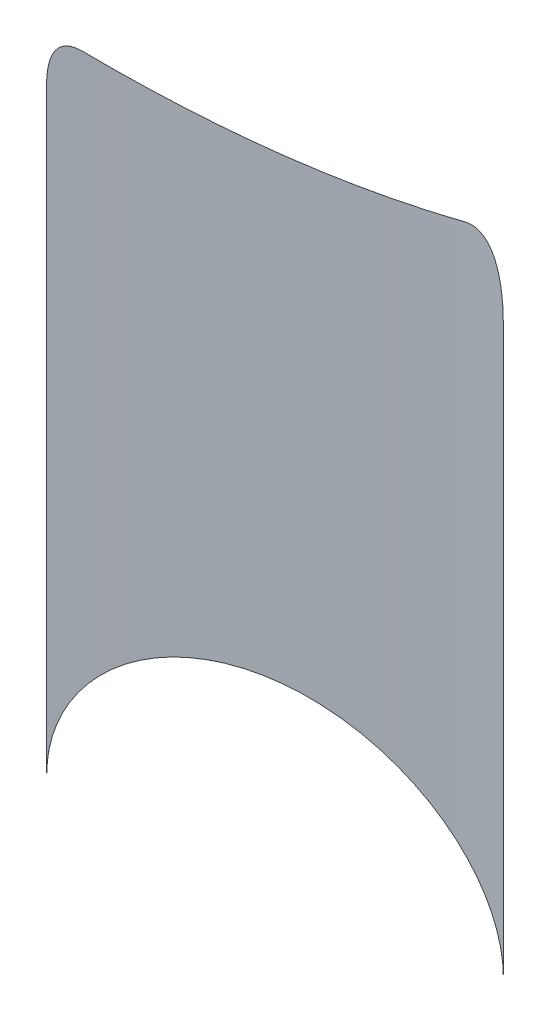
ISO-10303-21;
HEADER;
FILE_DESCRIPTION(('STEP AP214'),'2;1');
FILE_NAME('part.step','',(''),(''),'','','');
FILE_SCHEMA(('AUTOMOTIVE_DESIGN { 1 0 10303 214 1 1 1 1 }'));
ENDSEC;
DATA;
#1=APPLICATION_CONTEXT('core data for automotive mechanical design processes');
#2=APPLICATION_PROTOCOL_DEFINITION('international standard','automotive_design',2000,#1);
#3=PRODUCT_CONTEXT('',#1,'mechanical');
#4=PRODUCT('Part','Part','',(#3));
#5=PRODUCT_RELATED_PRODUCT_CATEGORY('part','',(#4));
#6=PRODUCT_DEFINITION_FORMATION('','',#4);
#7=PRODUCT_DEFINITION_CONTEXT('part definition',#1,'design');
#8=PRODUCT_DEFINITION('design','',#6,#7);
#9=PRODUCT_DEFINITION_SHAPE('','',#8);
#10=(LENGTH_UNIT() NAMED_UNIT(*) SI_UNIT(.MILLI.,.METRE.));
#11=(NAMED_UNIT(*) PLANE_ANGLE_UNIT() SI_UNIT($,.RADIAN.));
#12=(NAMED_UNIT(*) SI_UNIT($,.STERADIAN.) SOLID_ANGLE_UNIT());
#13=UNCERTAINTY_MEASURE_WITH_UNIT(LENGTH_MEASURE(1.E-05),#10,'distance_accuracy_value','');
#14=(GEOMETRIC_REPRESENTATION_CONTEXT(3) GLOBAL_UNCERTAINTY_ASSIGNED_CONTEXT((#13)) GLOBAL_UNIT_ASSIGNED_CONTEXT((#10,
#11,#12)) REPRESENTATION_CONTEXT('',''));
#15=CARTESIAN_POINT('',(0.,0.,0.));
#16=DIRECTION('',(0.,0.,1.));
#17=DIRECTION('',(1.,0.,0.));
#18=AXIS2_PLACEMENT_3D('',#15,#16,#17);
#19=CARTESIAN_POINT('',(8.98025612106915,25.4,8.98025612106916));
#20=DIRECTION('',(-0.707106781186548,0.,0.707106781186547));
#21=DIRECTION('',(0.707106781186547,0.,0.707106781186548));
#22=AXIS2_PLACEMENT_3D('',#19,#20,#21);
#23=PLANE('',#22);
#24=DIRECTION('',(0.,-1.,0.));
#25=VECTOR('',#24,1.);
#26=CARTESIAN_POINT('',(0.,25.4,0.));
#27=LINE('',#26,#25);
#28=CARTESIAN_POINT('',(0.,1.06417616721808,0.));
#29=VERTEX_POINT('',#28);
#30=CARTESIAN_POINT('',(0.,0.,0.));
#31=VERTEX_POINT('',#30);
#32=EDGE_CURVE('E98',#29,#31,#27,.T.);
#33=ORIENTED_EDGE('',*,*,#32,.F.);
#34=DIRECTION('',(-0.295766009193433,-0.908319842132484,-0.295766009193433));
#35=VECTOR('',#34,1.);
#36=CARTESIAN_POINT('',(8.10896364051453,25.967418408936,8.10896364051454));
#37=LINE('',#36,#35);
#38=CARTESIAN_POINT('',(6.89226441781786,22.2308428338847,6.89226441781787));
#39=VERTEX_POINT('',#38);
#40=EDGE_CURVE('E50',#29,#39,#37,.F.);
#41=ORIENTED_EDGE('',*,*,#40,.T.);
#42=DIRECTION('',(0.,1.,0.));
#43=VECTOR('',#42,1.);
#44=CARTESIAN_POINT('',(6.89226441781786,0.,6.89226441781787));
#45=LINE('',#44,#43);
#46=CARTESIAN_POINT('',(6.89226441781787,0.,6.89226441781787));
#47=VERTEX_POINT('',#46);
#48=EDGE_CURVE('E81',#39,#47,#45,.F.);
#49=ORIENTED_EDGE('',*,*,#48,.T.);
#50=DIRECTION('',(-0.707106781186547,0.,-0.707106781186548));
#51=VECTOR('',#50,1.);
#52=CARTESIAN_POINT('',(8.98025612106915,0.,8.98025612106916));
#53=LINE('',#52,#51);
#54=EDGE_CURVE('E84',#47,#31,#53,.T.);
#55=ORIENTED_EDGE('',*,*,#54,.T.);
#56=EDGE_LOOP('',(#33,#41,#49,#55));
#57=FACE_BOUND('',#56,.T.);
#58=ADVANCED_FACE('F33',(#57),#23,.F.);
#59=CARTESIAN_POINT('',(0.,25.4,0.));
#60=DIRECTION('',(0.707106781186548,0.,0.707106781186547));
#61=DIRECTION('',(0.707106781186547,0.,-0.707106781186548));
#62=AXIS2_PLACEMENT_3D('',#59,#60,#61);
#63=PLANE('',#62);
#64=DIRECTION('',(-0.3638034375545,0.857492925712544,0.3638034375545));
#65=VECTOR('',#64,1.);
#66=CARTESIAN_POINT('',(-7.19169637985441,19.2976432658842,7.19169637985442));
#67=LINE('',#66,#65);
#68=CARTESIAN_POINT('',(-8.98025612106915,23.5133190044515,8.98025612106916));
#69=VERTEX_POINT('',#68);
#70=CARTESIAN_POINT('',(-0.0480911682092548,2.46000430830475,0.0480911682092557));
#71=VERTEX_POINT('',#70);
#72=EDGE_CURVE('E58',#69,#71,#67,.F.);
#73=ORIENTED_EDGE('',*,*,#72,.T.);
#74=CARTESIAN_POINT('',(-1.79605122421383,1.06417616721809,1.79605122421383));
#75=DIRECTION('',(0.707106781186548,0.,0.707106781186547));
#76=DIRECTION('',(0.,-1.,0.));
#77=AXIS2_PLACEMENT_3D('',#74,#75,#76);
#78=ELLIPSE('',#77,6.07254102360086,2.54);
#79=EDGE_CURVE('E190',#71,#29,#78,.F.);
#80=ORIENTED_EDGE('',*,*,#79,.T.);
#81=ORIENTED_EDGE('',*,*,#32,.T.);
#82=CARTESIAN_POINT('',(-4.49012806053458,0.,4.49012806053458));
#83=DIRECTION('',(-0.707106781186548,0.,-0.707106781186547));
#84=DIRECTION('',(-0.707106781186547,0.,0.707106781186548));
#85=AXIS2_PLACEMENT_3D('',#82,#83,#84);
#86=CIRCLE('',#85,6.35);
#87=CARTESIAN_POINT('',(-8.98025612106915,0.,8.98025612106915));
#88=VERTEX_POINT('',#87);
#89=EDGE_CURVE('E88',#88,#31,#86,.T.);
#90=ORIENTED_EDGE('',*,*,#89,.F.);
#91=DIRECTION('',(0.,-1.,0.));
#92=VECTOR('',#91,1.);
#93=CARTESIAN_POINT('',(-8.98025612106915,25.4,8.98025612106915));
#94=LINE('',#93,#92);
#95=EDGE_CURVE('E94',#69,#88,#94,.T.);
#96=ORIENTED_EDGE('',*,*,#95,.F.);
#97=EDGE_LOOP('',(#73,#80,#81,#90,#96));
#98=FACE_BOUND('',#97,.T.);
#99=ADVANCED_FACE('F135',(#98),#63,.F.);
#100=CARTESIAN_POINT('',(4.49112806053458,0.,13.4713841816037));
#101=DIRECTION('',(-0.707106781186548,0.,-0.707106781186547));
#102=DIRECTION('',(-0.707106781186547,0.,0.707106781186548));
#103=AXIS2_PLACEMENT_3D('',#100,#101,#102);
#104=CYLINDRICAL_SURFACE('',#103,6.35);
#105=ORIENTED_EDGE('',*,*,#54,.F.);
#106=CARTESIAN_POINT('',(6.89226441781787,0.,6.89226441781787));
#107=CARTESIAN_POINT('',(6.89231786268577,0.146464266932523,6.89226603189647));
#108=CARTESIAN_POINT('',(6.88534393608151,0.292903551711731,6.89250786652074));
#109=CARTESIAN_POINT('',(6.85774536016748,0.58437728353009,6.89348342121486));
#110=CARTESIAN_POINT('',(6.83713137518341,0.729412738326902,6.89421675701585));
#111=CARTESIAN_POINT('',(6.78288330166258,1.01575440562524,6.89617848832311));
#112=CARTESIAN_POINT('',(6.74935952272647,1.15708166015502,6.89740269308693));
#113=CARTESIAN_POINT('',(6.66997671763164,1.43622946655273,6.90036756184506));
#114=CARTESIAN_POINT('',(6.6241159018581,1.57404950648552,6.90210830077175));
#115=CARTESIAN_POINT('',(6.52106426830367,1.84486526237348,6.90612637994501));
#116=CARTESIAN_POINT('',(6.46390980368465,1.97787487840589,6.90840200279425));
#117=CARTESIAN_POINT('',(6.33910394979764,2.23888758463778,6.91352345788086));
#118=CARTESIAN_POINT('',(6.271448650845,2.36688878778235,6.9163695026139));
#119=CARTESIAN_POINT('',(6.05394436014109,2.74297661096257,6.92582153160135));
#120=CARTESIAN_POINT('',(5.88969582449479,2.982792457952,6.93333635730444));
#121=CARTESIAN_POINT('',(5.45962023332488,3.52740374877561,6.95454882343234));
#122=CARTESIAN_POINT('',(5.17925017573937,3.82065502091561,6.96951574534301));
#123=CARTESIAN_POINT('',(4.7266375383656,4.22347198930852,6.99634391436973));
#124=CARTESIAN_POINT('',(4.57020668481364,4.35170554005229,7.00603122212342));
#125=CARTESIAN_POINT('',(4.24817707801223,4.59595325611578,7.02693193610189));
#126=CARTESIAN_POINT('',(4.08257814973793,4.71196718803176,7.03814537146745));
#127=CARTESIAN_POINT('',(3.47628180805622,5.10535651982054,7.08112248210658));
#128=CARTESIAN_POINT('',(3.01329173828311,5.34892477247129,7.11742455559746));
#129=CARTESIAN_POINT('',(2.29555315845657,5.65506900755827,7.18018408217893));
#130=CARTESIAN_POINT('',(2.05226528829994,5.74728980655902,7.20250558254947));
#131=CARTESIAN_POINT('',(1.55935259452895,5.9122643909091,7.24996220167878));
#132=CARTESIAN_POINT('',(1.30972823015546,5.98501958265347,7.27509711698139));
#133=CARTESIAN_POINT('',(0.802954853204813,6.11174135014063,7.32847649473377));
#134=CARTESIAN_POINT('',(0.545751941078245,6.16547774598268,7.35675394659011));
#135=CARTESIAN_POINT('',(0.0282539286177793,6.25285396692723,7.41610562000074));
#136=CARTESIAN_POINT('',(-0.232042355694297,6.2864858267193,7.44718094445436));
#137=CARTESIAN_POINT('',(-1.01543535765003,6.35676895362889,7.54449634510395));
#138=CARTESIAN_POINT('',(-1.54129235236765,6.36287162878345,7.61485265650282));
#139=CARTESIAN_POINT('',(-2.34394964255661,6.30686231553066,7.72996941383935));
#140=CARTESIAN_POINT('',(-2.62370678885989,6.2749275565033,7.77156026853689));
#141=CARTESIAN_POINT('',(-3.17898156920784,6.18569715037695,7.85694997365709));
#142=CARTESIAN_POINT('',(-3.45449852780518,6.1283975051352,7.9007491712052));
#143=CARTESIAN_POINT('',(-3.99818001377298,5.98781502390654,7.9899079483081));
#144=CARTESIAN_POINT('',(-4.26635361569772,5.90456599209868,8.03526542988176));
#145=CARTESIAN_POINT('',(-4.79274413138009,5.71141859279293,8.12685180912806));
#146=CARTESIAN_POINT('',(-5.05096537516956,5.6015319698893,8.17308031450196));
#147=CARTESIAN_POINT('',(-5.48013868435251,5.39096474578477,8.25189856022911));
#148=CARTESIAN_POINT('',(-5.65443959357658,5.29706601921951,8.28450466454691));
#149=CARTESIAN_POINT('',(-5.99508639732982,5.09570547271911,8.34930103909034));
#150=CARTESIAN_POINT('',(-6.16143421646501,4.98824695732417,8.38149140853128));
#151=CARTESIAN_POINT('',(-6.48474987782162,4.75981950106652,8.44502161648687));
#152=CARTESIAN_POINT('',(-6.64171858179995,4.63885180437206,8.4763615329966));
#153=CARTESIAN_POINT('',(-6.94468036242119,4.38367162799479,8.53769408471028));
#154=CARTESIAN_POINT('',(-7.09067852163273,4.24946534913265,8.56768734118668));
#155=CARTESIAN_POINT('',(-7.37141312714916,3.96690683144641,8.62607778306396));
#156=CARTESIAN_POINT('',(-7.50603543538131,3.81843734286062,8.65445802719843));
#157=CARTESIAN_POINT('',(-7.76078540057205,3.50908791766845,8.7087509958779));
#158=CARTESIAN_POINT('',(-7.88091276010341,3.34820772651328,8.7346636697876));
#159=CARTESIAN_POINT('',(-8.104763244882,3.01528636703068,8.78339893810602));
#160=CARTESIAN_POINT('',(-8.2085095828281,2.843261488096,8.80622589839449));
#161=CARTESIAN_POINT('',(-8.39811244981295,2.48921583493486,8.84825850935189));
#162=CARTESIAN_POINT('',(-8.48397316805694,2.30719741406438,8.86746500791211));
#163=CARTESIAN_POINT('',(-8.62839890123783,1.95418073615665,8.89995854176545));
#164=CARTESIAN_POINT('',(-8.68887202997785,1.78399950930717,8.91365306195356));
#165=CARTESIAN_POINT('',(-8.7933261196175,1.43842654687922,8.93739658454374));
#166=CARTESIAN_POINT('',(-8.83731011327611,1.26303577587524,8.94744625731214));
#167=CARTESIAN_POINT('',(-8.90833571020233,0.907365222328347,8.96371134360323));
#168=CARTESIAN_POINT('',(-8.93525709532225,0.727059885004358,8.96989954572311));
#169=CARTESIAN_POINT('',(-8.96222988884391,0.455206687917933,8.97610467707343));
#170=CARTESIAN_POINT('',(-8.96898595779961,0.364312516855359,8.97766019891954));
#171=CARTESIAN_POINT('',(-8.97799968204063,0.182284254532988,8.97973621841577));
#172=CARTESIAN_POINT('',(-8.98025706954431,0.0911501493145293,8.98025665445295));
#173=CARTESIAN_POINT('',(-8.98025612106915,0.,8.98025612106916));
#174=B_SPLINE_CURVE_WITH_KNOTS('',3,(#106,#107,#108,#109,#110,#111,#112,#113,#114,#115,#116,
#117,#118,#119,#120,#121,#122,#123,#124,#125,#126,#127,#128,#129,#130,#131,#132,#133,#134,#135,
#136,#137,#138,#139,#140,#141,#142,#143,#144,#145,#146,#147,#148,#149,#150,#151,#152,#153,#154,
#155,#156,#157,#158,#159,#160,#161,#162,#163,#164,#165,#166,#167,#168,#169,#170,#171,#172,#173),
.UNSPECIFIED.,.F.,.F.,(4,2,2,2,2,2,2,2,2,2,2,2,2,2,2,2,2,2,2,2,2,2,2,2,2,2,2,2,2,2,2,2,2,4),(0.,
0.439187234392796,0.87803150028592,1.3132063440877,1.74844434857404,2.18230353980809,
2.61632465529158,3.48549768418151,4.69654991425257,5.30360526434246,5.91067220753581,
7.47435838769038,8.25722222233591,9.04002947958805,9.83201061851013,10.6243053285468,
12.208106776988,13.0610870196728,13.9142017613559,14.7662097654097,15.6178427976393,
16.2192450957366,16.8205011132564,17.4217018019099,18.0226222192899,18.6289922855524,
19.2353747920322,19.8408901604922,20.4462635440797,20.9888042223851,21.5312450650542,
22.0774665011611,22.3508394379037,22.6242286465399),.UNSPECIFIED.);
#175=EDGE_CURVE('E92',#47,#88,#174,.T.);
#176=ORIENTED_EDGE('',*,*,#175,.T.);
#177=ORIENTED_EDGE('',*,*,#89,.T.);
#178=EDGE_LOOP('',(#105,#176,#177));
#179=FACE_BOUND('',#178,.T.);
#180=ADVANCED_FACE('F100',(#179),#104,.F.);
#181=CARTESIAN_POINT('',(9.83817531139002,0.,90.6604804010124));
#182=DIRECTION('',(0.,1.,0.));
#183=DIRECTION('',(0.,0.,1.));
#184=AXIS2_PLACEMENT_3D('',#181,#182,#183);
#185=CYLINDRICAL_SURFACE('',#184,83.82);
#186=ORIENTED_EDGE('',*,*,#48,.F.);
#187=CARTESIAN_POINT('',(6.89226441781786,22.2308428338847,6.89226441781787));
#188=CARTESIAN_POINT('',(6.89223624604212,22.3382280548909,6.8922657166894));
#189=CARTESIAN_POINT('',(6.89063404030181,22.445633096517,6.89232178106609));
#190=CARTESIAN_POINT('',(6.88365271798926,22.660465560547,6.89256755520397));
#191=CARTESIAN_POINT('',(6.87826836921666,22.767892807611,6.89275745010694));
#192=CARTESIAN_POINT('',(6.86295805269845,22.9843264958137,6.89329982210327));
#193=CARTESIAN_POINT('',(6.85295444686684,23.0933277688698,6.89365507937744));
#194=CARTESIAN_POINT('',(6.82742072206648,23.3106148105154,6.89456898632329));
#195=CARTESIAN_POINT('',(6.81189382273983,23.4189009585884,6.89512751750679));
#196=CARTESIAN_POINT('',(6.7689192234816,23.6632782202462,6.89668935166513));
#197=CARTESIAN_POINT('',(6.73939111077952,23.799036430148,6.89777177157176));
#198=CARTESIAN_POINT('',(6.68372563147256,23.9992394884933,6.8998561710643));
#199=CARTESIAN_POINT('',(6.66332441867093,24.0652791953822,6.90062586847219));
#200=CARTESIAN_POINT('',(6.61792683813297,24.1957408529132,6.90235887096285));
#201=CARTESIAN_POINT('',(6.59293338094456,24.2601637990221,6.90332205345134));
#202=CARTESIAN_POINT('',(6.53576332969003,24.3901741953671,6.90555610612049));
#203=CARTESIAN_POINT('',(6.50325960866431,24.4556202857114,6.90684133453551));
#204=CARTESIAN_POINT('',(6.43045827496407,24.5821226866532,6.90977175156027));
#205=CARTESIAN_POINT('',(6.39016503216851,24.6431814323058,6.91141673841512));
#206=CARTESIAN_POINT('',(6.31001073011526,24.7453885042959,6.91476000712852));
#207=CARTESIAN_POINT('',(6.27199447153882,24.7879660102371,6.91636741006014));
#208=CARTESIAN_POINT('',(6.18966123919118,24.8665302677593,6.91991416024493));
#209=CARTESIAN_POINT('',(6.14535600778361,24.9025290224964,6.92185289021155));
#210=CARTESIAN_POINT('',(6.05924434833828,24.9597737738415,6.92569920530859));
#211=CARTESIAN_POINT('',(6.01843307496056,24.9825101464512,6.92754911334048));
#212=CARTESIAN_POINT('',(5.93354806910646,25.0206775912887,6.9314646195441));
#213=CARTESIAN_POINT('',(5.88947733577741,25.0361152849223,6.93353002013476));
#214=CARTESIAN_POINT('',(5.79939173071504,25.0591347089814,6.93782720400669));
#215=CARTESIAN_POINT('',(5.75337834851048,25.0667223485471,6.94005886077977));
#216=CARTESIAN_POINT('',(5.66068894209431,25.0743754842614,6.94463265007106));
#217=CARTESIAN_POINT('',(5.61401196562638,25.074428781475,6.94697495560949));
#218=CARTESIAN_POINT('',(5.54260118991025,25.0694213366971,6.95061793075643));
#219=CARTESIAN_POINT('',(5.51766682050696,25.0667057341407,6.95190124939669));
#220=CARTESIAN_POINT('',(5.46816445061018,25.0595451821335,6.95447096067342));
#221=CARTESIAN_POINT('',(5.44359528637048,25.0551083234035,6.95575731134814));
#222=CARTESIAN_POINT('',(5.41919327466185,25.0498937114769,6.9570455983768));
#223=B_SPLINE_CURVE_WITH_KNOTS('',3,(#187,#188,#189,#190,#191,#192,#193,#194,#195,#196,#197,
#198,#199,#200,#201,#202,#203,#204,#205,#206,#207,#208,#209,#210,#211,#212,#213,#214,#215,#216,
#217,#218,#219,#220,#221,#222),.UNSPECIFIED.,.F.,.F.,(4,2,2,2,2,2,2,2,2,2,2,2,2,2,2,2,2,4),(0.,
0.322172814721493,0.644792201937843,0.973043252485034,1.30110327141238,1.71716023776949,
1.92440247510341,2.13151381332329,2.3503776208331,2.56911900138989,2.73986786729972,
2.91030201607229,3.04993855898449,3.18944817853913,3.3288527054369,3.46848294112795,
3.54377412472229,3.61871561027479),.UNSPECIFIED.);
#224=CARTESIAN_POINT('',(5.41919327466182,25.0498937114769,6.9570455983768));
#225=VERTEX_POINT('',#224);
#226=EDGE_CURVE('E11',#39,#225,#223,.T.);
#227=ORIENTED_EDGE('',*,*,#226,.T.);
#228=CARTESIAN_POINT('',(9.83817531139002,253.802829579968,90.6604804010124));
#229=DIRECTION('',(0.12250574276124,-0.343127762229375,0.931265634380426));
#230=DIRECTION('',(0.0447520762715553,0.939288740903169,0.340196873709803));
#231=AXIS2_PLACEMENT_3D('',#228,#229,#230);
#232=ELLIPSE('',#231,244.282186481803,83.82);
#233=CARTESIAN_POINT('',(-7.80224593103042,25.1081782440382,8.71776908151824));
#234=VERTEX_POINT('',#233);
#235=EDGE_CURVE('E89',#234,#225,#232,.T.);
#236=ORIENTED_EDGE('',*,*,#235,.F.);
#237=CARTESIAN_POINT('',(-7.80224593103041,25.1081782440382,8.71776908151824));
#238=CARTESIAN_POINT('',(-7.85124310719842,25.1192894454969,8.72831590472687));
#239=CARTESIAN_POINT('',(-7.90100235006187,25.127879137099,8.73907507952596));
#240=CARTESIAN_POINT('',(-8.00193054186717,25.1383808470641,8.76099516304829));
#241=CARTESIAN_POINT('',(-8.05310934178039,25.1401851930637,8.77215973343183));
#242=CARTESIAN_POINT('',(-8.15563748074235,25.1349944785285,8.79462743754947));
#243=CARTESIAN_POINT('',(-8.20698386924885,25.1279161940837,8.80593088443336));
#244=CARTESIAN_POINT('',(-8.30690442540771,25.103272554648,8.828023080225));
#245=CARTESIAN_POINT('',(-8.35549643504364,25.0857859260143,8.83881504295448));
#246=CARTESIAN_POINT('',(-8.44087908047449,25.0437083616026,8.85785082794551));
#247=CARTESIAN_POINT('',(-8.47835122796181,25.0205553562951,8.86623520465838));
#248=CARTESIAN_POINT('',(-8.54863298183429,24.9676485421242,8.8820053405404));
#249=CARTESIAN_POINT('',(-8.58143166591531,24.9378796735804,8.8893887584861));
#250=CARTESIAN_POINT('',(-8.64862574016535,24.8661408453702,8.9045507324709));
#251=CARTESIAN_POINT('',(-8.68174509999997,24.822930505309,8.91205000081372));
#252=CARTESIAN_POINT('',(-8.74086482362177,24.7317210010483,8.92546599293845));
#253=CARTESIAN_POINT('',(-8.76685338615355,24.6837140755924,8.93138009294455));
#254=CARTESIAN_POINT('',(-8.82934214694941,24.5494169569639,8.94562325883508));
#255=CARTESIAN_POINT('',(-8.8600373768356,24.4603362323136,8.9526477034953));
#256=CARTESIAN_POINT('',(-8.90917156460977,24.2785237065453,8.96390780788829));
#257=CARTESIAN_POINT('',(-8.92754194348377,24.18577446812,8.96812786197195));
#258=CARTESIAN_POINT('',(-8.95584332928105,23.9958788483491,8.97463415130519));
#259=CARTESIAN_POINT('',(-8.96547858282362,23.898687880974,8.97685260551855));
#260=CARTESIAN_POINT('',(-8.97461422978773,23.753358522941,8.97895645434639));
#261=CARTESIAN_POINT('',(-8.97677646142235,23.7053603945483,8.97945450373208));
#262=CARTESIAN_POINT('',(-8.97959461695094,23.6093487364536,8.98010370458951));
#263=CARTESIAN_POINT('',(-8.9802515508233,23.5613352387083,8.98025508865603));
#264=CARTESIAN_POINT('',(-8.98025612106917,23.5133190044515,8.98025612106918));
#265=B_SPLINE_CURVE_WITH_KNOTS('',3,(#237,#238,#239,#240,#241,#242,#243,#244,#245,#246,#247,
#248,#249,#250,#251,#252,#253,#254,#255,#256,#257,#258,#259,#260,#261,#262,#263,#264),
.UNSPECIFIED.,.F.,.F.,(4,2,2,2,2,2,2,2,2,2,2,2,2,4),(0.,0.154288521093926,0.31101526253602,
0.469221446230433,0.626245934791227,0.759986499605907,0.894034674135459,1.05798639050899,
1.222207827532,1.50406165464101,1.78747107087935,2.0801521685389,2.22428401467488,
2.36831912730641),.UNSPECIFIED.);
#266=EDGE_CURVE('E43',#234,#69,#265,.T.);
#267=ORIENTED_EDGE('',*,*,#266,.T.);
#268=ORIENTED_EDGE('',*,*,#95,.T.);
#269=ORIENTED_EDGE('',*,*,#175,.F.);
#270=EDGE_LOOP('',(#186,#227,#236,#267,#268,#269));
#271=FACE_BOUND('',#270,.T.);
#272=ADVANCED_FACE('F93',(#271),#185,.F.);
#273=CARTESIAN_POINT('',(-0.177948680482893,0.498418532466415,-1.35273242773639));
#274=DIRECTION('',(0.12250574276124,-0.343127762229375,0.931265634380426));
#275=DIRECTION('',(0.,-0.938333344565716,-0.345731882354111));
#276=AXIS2_PLACEMENT_3D('',#273,#274,#275);
#277=PLANE('',#276);
#278=ORIENTED_EDGE('',*,*,#235,.T.);
#279=DIRECTION('',(-0.295766009193433,-0.908319842132484,-0.295766009193433));
#280=VECTOR('',#279,1.);
#281=CARTESIAN_POINT('',(-2.39310688157884,1.05772752591887,-0.855254557863908));
#282=LINE('',#281,#280);
#283=CARTESIAN_POINT('',(-0.311164586613552,7.45153018718087,1.22668773710138));
#284=VERTEX_POINT('',#283);
#285=EDGE_CURVE('E192',#225,#284,#282,.T.);
#286=ORIENTED_EDGE('',*,*,#285,.T.);
#287=DIRECTION('',(-0.3638034375545,0.857492925712544,0.3638034375545));
#288=VECTOR('',#287,1.);
#289=CARTESIAN_POINT('',(2.21694565868925,1.49271719371157,-1.30142250820142));
#290=LINE('',#289,#288);
#291=EDGE_CURVE('E97',#284,#234,#290,.T.);
#292=ORIENTED_EDGE('',*,*,#291,.T.);
#293=EDGE_LOOP('',(#278,#286,#292));
#294=FACE_BOUND('',#293,.T.);
#295=ADVANCED_FACE('F117',(#294),#277,.F.);
#296=CARTESIAN_POINT('',(2.5281102453028,0.621172677648954,1.06399220312486));
#297=DIRECTION('',(-0.3638034375545,0.857492925712544,0.3638034375545));
#298=DIRECTION('',(0.,-0.390566732942473,0.920574617898323));
#299=AXIS2_PLACEMENT_3D('',#296,#297,#298);
#300=CYLINDRICAL_SURFACE('',#299,2.54);
#301=ORIENTED_EDGE('',*,*,#266,.F.);
#302=ORIENTED_EDGE('',*,*,#291,.F.);
#303=CARTESIAN_POINT('',(0.,6.57998567111826,3.59210244842766));
#304=DIRECTION('',(-0.991812087080375,-0.0764297835548259,0.102309687258998));
#305=DIRECTION('',(-0.0360711368241763,0.936174036690414,0.3496813493954));
#306=AXIS2_PLACEMENT_3D('',#303,#304,#305);
#307=ELLIPSE('',#306,7.63893086195945,2.54);
#308=EDGE_CURVE('E38',#71,#284,#307,.F.);
#309=ORIENTED_EDGE('',*,*,#308,.F.);
#310=ORIENTED_EDGE('',*,*,#72,.F.);
#311=EDGE_LOOP('',(#301,#302,#309,#310));
#312=FACE_BOUND('',#311,.T.);
#313=ADVANCED_FACE('F35',(#312),#300,.T.);
#314=CARTESIAN_POINT('',(-2.08194229496529,0.186183009856261,1.51016015346238));
#315=DIRECTION('',(-0.295766009193433,-0.908319842132484,-0.295766009193433));
#316=DIRECTION('',(0.,0.309618197676437,-0.950860963373508));
#317=AXIS2_PLACEMENT_3D('',#314,#315,#316);
#318=CYLINDRICAL_SURFACE('',#317,2.54);
#319=ORIENTED_EDGE('',*,*,#226,.F.);
#320=ORIENTED_EDGE('',*,*,#40,.F.);
#321=ORIENTED_EDGE('',*,*,#79,.F.);
#322=ORIENTED_EDGE('',*,*,#308,.T.);
#323=ORIENTED_EDGE('',*,*,#285,.F.);
#324=EDGE_LOOP('',(#319,#320,#321,#322,#323));
#325=FACE_BOUND('',#324,.T.);
#326=ADVANCED_FACE('F129',(#325),#318,.T.);
#327=CLOSED_SHELL('',(#58,#99,#180,#272,#295,#313,#326));
#328=MANIFOLD_SOLID_BREP('B2',#327);
#329=ADVANCED_BREP_SHAPE_REPRESENTATION('',(#18,#328),#14);
#330=SHAPE_DEFINITION_REPRESENTATION(#9,#329);
ENDSEC;
END-ISO-10303-21;
